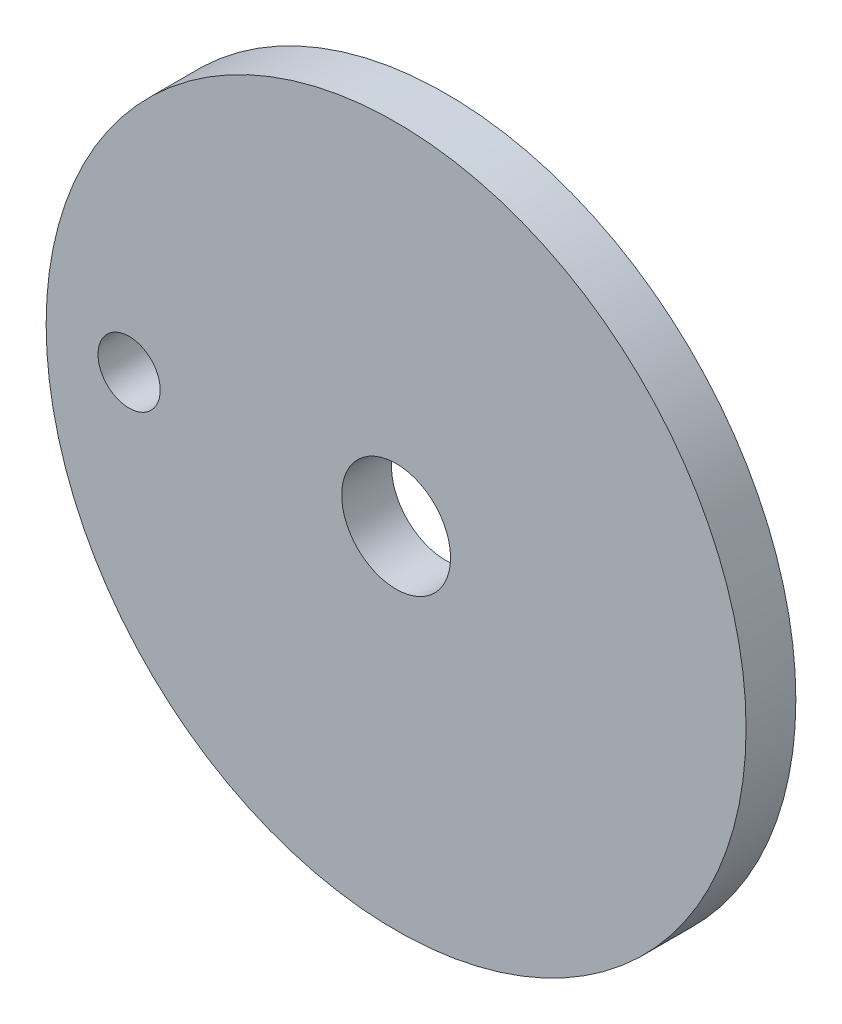
ISO-10303-21;
HEADER;
FILE_DESCRIPTION(('STEP AP214'),'2;1');
FILE_NAME('part.step','',(''),(''),'','','');
FILE_SCHEMA(('AUTOMOTIVE_DESIGN { 1 0 10303 214 1 1 1 1 }'));
ENDSEC;
DATA;
#1=APPLICATION_CONTEXT('core data for automotive mechanical design processes');
#2=APPLICATION_PROTOCOL_DEFINITION('international standard','automotive_design',2000,#1);
#3=PRODUCT_CONTEXT('',#1,'mechanical');
#4=PRODUCT('Part','Part','',(#3));
#5=PRODUCT_RELATED_PRODUCT_CATEGORY('part','',(#4));
#6=PRODUCT_DEFINITION_FORMATION('','',#4);
#7=PRODUCT_DEFINITION_CONTEXT('part definition',#1,'design');
#8=PRODUCT_DEFINITION('design','',#6,#7);
#9=PRODUCT_DEFINITION_SHAPE('','',#8);
#10=(LENGTH_UNIT() NAMED_UNIT(*) SI_UNIT(.MILLI.,.METRE.));
#11=(NAMED_UNIT(*) PLANE_ANGLE_UNIT() SI_UNIT($,.RADIAN.));
#12=(NAMED_UNIT(*) SI_UNIT($,.STERADIAN.) SOLID_ANGLE_UNIT());
#13=UNCERTAINTY_MEASURE_WITH_UNIT(LENGTH_MEASURE(1.E-05),#10,'distance_accuracy_value','');
#14=(GEOMETRIC_REPRESENTATION_CONTEXT(3) GLOBAL_UNCERTAINTY_ASSIGNED_CONTEXT((#13)) GLOBAL_UNIT_ASSIGNED_CONTEXT((#10,
#11,#12)) REPRESENTATION_CONTEXT('',''));
#15=CARTESIAN_POINT('',(0.,0.,0.));
#16=DIRECTION('',(0.,0.,1.));
#17=DIRECTION('',(1.,0.,0.));
#18=AXIS2_PLACEMENT_3D('',#15,#16,#17);
#19=CARTESIAN_POINT('',(0.,0.,3.2));
#20=DIRECTION('',(0.,0.,1.));
#21=DIRECTION('',(1.,0.,0.));
#22=AXIS2_PLACEMENT_3D('',#19,#20,#21);
#23=PLANE('',#22);
#24=CARTESIAN_POINT('',(-17.1655859216768,0.,3.2));
#25=DIRECTION('',(0.,0.,1.));
#26=DIRECTION('',(1.,0.,0.));
#27=AXIS2_PLACEMENT_3D('',#24,#25,#26);
#28=CIRCLE('',#27,2.);
#29=CARTESIAN_POINT('',(-15.1655859216768,0.,3.2));
#30=VERTEX_POINT('',#29);
#31=EDGE_CURVE('E48',#30,#30,#28,.T.);
#32=ORIENTED_EDGE('',*,*,#31,.F.);
#33=EDGE_LOOP('',(#32));
#34=FACE_BOUND('',#33,.T.);
#35=CARTESIAN_POINT('',(0.,0.,3.2));
#36=DIRECTION('',(0.,0.,1.));
#37=DIRECTION('',(1.,0.,0.));
#38=AXIS2_PLACEMENT_3D('',#35,#36,#37);
#39=CIRCLE('',#38,22.5);
#40=CARTESIAN_POINT('',(22.5,0.,3.2));
#41=VERTEX_POINT('',#40);
#42=EDGE_CURVE('E10',#41,#41,#39,.T.);
#43=ORIENTED_EDGE('',*,*,#42,.T.);
#44=EDGE_LOOP('',(#43));
#45=FACE_BOUND('',#44,.T.);
#46=CARTESIAN_POINT('',(0.,0.,3.2));
#47=DIRECTION('',(0.,0.,1.));
#48=DIRECTION('',(1.,0.,0.));
#49=AXIS2_PLACEMENT_3D('',#46,#47,#48);
#50=CIRCLE('',#49,3.5);
#51=CARTESIAN_POINT('',(3.5,0.,3.2));
#52=VERTEX_POINT('',#51);
#53=EDGE_CURVE('E41',#52,#52,#50,.T.);
#54=ORIENTED_EDGE('',*,*,#53,.F.);
#55=EDGE_LOOP('',(#54));
#56=FACE_BOUND('',#55,.T.);
#57=ADVANCED_FACE('F28',(#34,#45,#56),#23,.T.);
#58=CARTESIAN_POINT('',(0.,0.,0.));
#59=DIRECTION('',(0.,0.,1.));
#60=DIRECTION('',(1.,0.,0.));
#61=AXIS2_PLACEMENT_3D('',#58,#59,#60);
#62=PLANE('',#61);
#63=CARTESIAN_POINT('',(-17.1655859216768,0.,0.));
#64=DIRECTION('',(0.,0.,1.));
#65=DIRECTION('',(1.,0.,0.));
#66=AXIS2_PLACEMENT_3D('',#63,#64,#65);
#67=CIRCLE('',#66,2.);
#68=CARTESIAN_POINT('',(-15.1655859216768,0.,0.));
#69=VERTEX_POINT('',#68);
#70=EDGE_CURVE('E32',#69,#69,#67,.T.);
#71=ORIENTED_EDGE('',*,*,#70,.T.);
#72=EDGE_LOOP('',(#71));
#73=FACE_BOUND('',#72,.T.);
#74=CARTESIAN_POINT('',(0.,0.,0.));
#75=DIRECTION('',(0.,0.,1.));
#76=DIRECTION('',(1.,0.,0.));
#77=AXIS2_PLACEMENT_3D('',#74,#75,#76);
#78=CIRCLE('',#77,22.5);
#79=CARTESIAN_POINT('',(22.5,0.,0.));
#80=VERTEX_POINT('',#79);
#81=EDGE_CURVE('E36',#80,#80,#78,.T.);
#82=ORIENTED_EDGE('',*,*,#81,.F.);
#83=EDGE_LOOP('',(#82));
#84=FACE_BOUND('',#83,.T.);
#85=CARTESIAN_POINT('',(0.,0.,0.));
#86=DIRECTION('',(0.,0.,1.));
#87=DIRECTION('',(1.,0.,0.));
#88=AXIS2_PLACEMENT_3D('',#85,#86,#87);
#89=CIRCLE('',#88,3.5);
#90=CARTESIAN_POINT('',(3.5,0.,0.));
#91=VERTEX_POINT('',#90);
#92=EDGE_CURVE('E43',#91,#91,#89,.T.);
#93=ORIENTED_EDGE('',*,*,#92,.T.);
#94=EDGE_LOOP('',(#93));
#95=FACE_BOUND('',#94,.T.);
#96=ADVANCED_FACE('F55',(#73,#84,#95),#62,.F.);
#97=CARTESIAN_POINT('',(0.,0.,3.2));
#98=DIRECTION('',(0.,0.,-1.));
#99=DIRECTION('',(-1.,0.,0.));
#100=AXIS2_PLACEMENT_3D('',#97,#98,#99);
#101=CYLINDRICAL_SURFACE('',#100,22.5);
#102=ORIENTED_EDGE('',*,*,#42,.F.);
#103=EDGE_LOOP('',(#102));
#104=FACE_BOUND('',#103,.T.);
#105=ORIENTED_EDGE('',*,*,#81,.T.);
#106=EDGE_LOOP('',(#105));
#107=FACE_BOUND('',#106,.T.);
#108=ADVANCED_FACE('F30',(#104,#107),#101,.T.);
#109=CARTESIAN_POINT('',(0.,0.,3.2));
#110=DIRECTION('',(0.,0.,-1.));
#111=DIRECTION('',(-1.,0.,0.));
#112=AXIS2_PLACEMENT_3D('',#109,#110,#111);
#113=CYLINDRICAL_SURFACE('',#112,3.5);
#114=ORIENTED_EDGE('',*,*,#53,.T.);
#115=EDGE_LOOP('',(#114));
#116=FACE_BOUND('',#115,.T.);
#117=ORIENTED_EDGE('',*,*,#92,.F.);
#118=EDGE_LOOP('',(#117));
#119=FACE_BOUND('',#118,.T.);
#120=ADVANCED_FACE('F60',(#116,#119),#113,.F.);
#121=CARTESIAN_POINT('',(-17.1655859216768,0.,-11.8));
#122=DIRECTION('',(0.,0.,1.));
#123=DIRECTION('',(1.,0.,0.));
#124=AXIS2_PLACEMENT_3D('',#121,#122,#123);
#125=CYLINDRICAL_SURFACE('',#124,2.);
#126=ORIENTED_EDGE('',*,*,#31,.T.);
#127=EDGE_LOOP('',(#126));
#128=FACE_BOUND('',#127,.T.);
#129=ORIENTED_EDGE('',*,*,#70,.F.);
#130=EDGE_LOOP('',(#129));
#131=FACE_BOUND('',#130,.T.);
#132=ADVANCED_FACE('F58',(#128,#131),#125,.F.);
#133=CLOSED_SHELL('',(#57,#96,#108,#120,#132));
#134=MANIFOLD_SOLID_BREP('B2',#133);
#135=ADVANCED_BREP_SHAPE_REPRESENTATION('',(#18,#134),#14);
#136=SHAPE_DEFINITION_REPRESENTATION(#9,#135);
ENDSEC;
END-ISO-10303-21;
